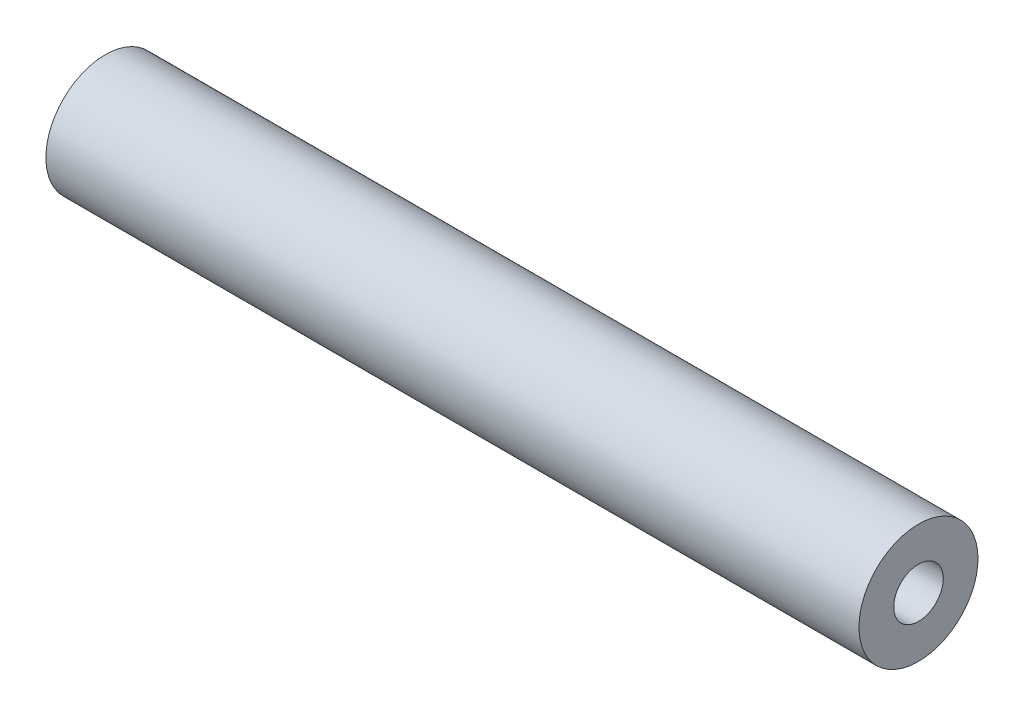
ISO-10303-21;
HEADER;
FILE_DESCRIPTION(('STEP AP214'),'2;1');
FILE_NAME('part.step','',(''),(''),'','','');
FILE_SCHEMA(('AUTOMOTIVE_DESIGN { 1 0 10303 214 1 1 1 1 }'));
ENDSEC;
DATA;
#1=APPLICATION_CONTEXT('core data for automotive mechanical design processes');
#2=APPLICATION_PROTOCOL_DEFINITION('international standard','automotive_design',2000,#1);
#3=PRODUCT_CONTEXT('',#1,'mechanical');
#4=PRODUCT('Part','Part','',(#3));
#5=PRODUCT_RELATED_PRODUCT_CATEGORY('part','',(#4));
#6=PRODUCT_DEFINITION_FORMATION('','',#4);
#7=PRODUCT_DEFINITION_CONTEXT('part definition',#1,'design');
#8=PRODUCT_DEFINITION('design','',#6,#7);
#9=PRODUCT_DEFINITION_SHAPE('','',#8);
#10=(LENGTH_UNIT() NAMED_UNIT(*) SI_UNIT(.MILLI.,.METRE.));
#11=(NAMED_UNIT(*) PLANE_ANGLE_UNIT() SI_UNIT($,.RADIAN.));
#12=(NAMED_UNIT(*) SI_UNIT($,.STERADIAN.) SOLID_ANGLE_UNIT());
#13=UNCERTAINTY_MEASURE_WITH_UNIT(LENGTH_MEASURE(1.E-05),#10,'distance_accuracy_value','');
#14=(GEOMETRIC_REPRESENTATION_CONTEXT(3) GLOBAL_UNCERTAINTY_ASSIGNED_CONTEXT((#13)) GLOBAL_UNIT_ASSIGNED_CONTEXT((#10,
#11,#12)) REPRESENTATION_CONTEXT('',''));
#15=CARTESIAN_POINT('',(0.,0.,0.));
#16=DIRECTION('',(0.,0.,1.));
#17=DIRECTION('',(1.,0.,0.));
#18=AXIS2_PLACEMENT_3D('',#15,#16,#17);
#19=CARTESIAN_POINT('',(0.,0.,0.));
#20=DIRECTION('',(-1.,0.,0.));
#21=DIRECTION('',(0.,0.,1.));
#22=AXIS2_PLACEMENT_3D('',#19,#20,#21);
#23=PLANE('',#22);
#24=CARTESIAN_POINT('',(0.,0.,0.));
#25=DIRECTION('',(1.,0.,0.));
#26=DIRECTION('',(0.,0.,-1.));
#27=AXIS2_PLACEMENT_3D('',#24,#25,#26);
#28=CIRCLE('',#27,3.);
#29=CARTESIAN_POINT('',(0.,0.,-3.));
#30=VERTEX_POINT('',#29);
#31=EDGE_CURVE('E10',#30,#30,#28,.T.);
#32=ORIENTED_EDGE('',*,*,#31,.F.);
#33=EDGE_LOOP('',(#32));
#34=FACE_BOUND('',#33,.T.);
#35=ADVANCED_FACE('F33',(#34),#23,.T.);
#36=CARTESIAN_POINT('',(0.,0.,0.));
#37=DIRECTION('',(1.,0.,0.));
#38=DIRECTION('',(0.,0.,-1.));
#39=AXIS2_PLACEMENT_3D('',#36,#37,#38);
#40=CYLINDRICAL_SURFACE('',#39,3.);
#41=ORIENTED_EDGE('',*,*,#31,.T.);
#42=EDGE_LOOP('',(#41));
#43=FACE_BOUND('',#42,.T.);
#44=CARTESIAN_POINT('',(41.,0.,0.));
#45=DIRECTION('',(1.,0.,0.));
#46=DIRECTION('',(0.,0.,-1.));
#47=AXIS2_PLACEMENT_3D('',#44,#45,#46);
#48=CIRCLE('',#47,3.);
#49=CARTESIAN_POINT('',(41.,0.,-3.));
#50=VERTEX_POINT('',#49);
#51=EDGE_CURVE('E39',#50,#50,#48,.T.);
#52=ORIENTED_EDGE('',*,*,#51,.F.);
#53=EDGE_LOOP('',(#52));
#54=FACE_BOUND('',#53,.T.);
#55=ADVANCED_FACE('F57',(#43,#54),#40,.T.);
#56=CARTESIAN_POINT('',(41.,0.,0.));
#57=DIRECTION('',(1.,0.,0.));
#58=DIRECTION('',(0.,0.,-1.));
#59=AXIS2_PLACEMENT_3D('',#56,#57,#58);
#60=PLANE('',#59);
#61=CARTESIAN_POINT('',(41.,0.,0.));
#62=DIRECTION('',(1.,0.,0.));
#63=DIRECTION('',(0.,0.,-1.));
#64=AXIS2_PLACEMENT_3D('',#61,#62,#63);
#65=CIRCLE('',#64,1.25);
#66=CARTESIAN_POINT('',(41.,0.,-1.25));
#67=VERTEX_POINT('',#66);
#68=EDGE_CURVE('E47',#67,#67,#65,.T.);
#69=ORIENTED_EDGE('',*,*,#68,.F.);
#70=EDGE_LOOP('',(#69));
#71=FACE_BOUND('',#70,.T.);
#72=ORIENTED_EDGE('',*,*,#51,.T.);
#73=EDGE_LOOP('',(#72));
#74=FACE_BOUND('',#73,.T.);
#75=ADVANCED_FACE('F55',(#71,#74),#60,.T.);
#76=CARTESIAN_POINT('',(31.,0.,0.));
#77=DIRECTION('',(1.,0.,0.));
#78=DIRECTION('',(0.,0.,-1.));
#79=AXIS2_PLACEMENT_3D('',#76,#77,#78);
#80=CYLINDRICAL_SURFACE('',#79,1.25);
#81=CARTESIAN_POINT('',(31.,0.,0.));
#82=DIRECTION('',(1.,0.,0.));
#83=DIRECTION('',(0.,0.,-1.));
#84=AXIS2_PLACEMENT_3D('',#81,#82,#83);
#85=CIRCLE('',#84,1.25);
#86=CARTESIAN_POINT('',(31.,0.,-1.25));
#87=VERTEX_POINT('',#86);
#88=EDGE_CURVE('E43',#87,#87,#85,.T.);
#89=ORIENTED_EDGE('',*,*,#88,.F.);
#90=EDGE_LOOP('',(#89));
#91=FACE_BOUND('',#90,.T.);
#92=ORIENTED_EDGE('',*,*,#68,.T.);
#93=EDGE_LOOP('',(#92));
#94=FACE_BOUND('',#93,.T.);
#95=ADVANCED_FACE('F53',(#91,#94),#80,.F.);
#96=CARTESIAN_POINT('',(31.,0.,0.));
#97=DIRECTION('',(1.,0.,0.));
#98=DIRECTION('',(0.,0.,-1.));
#99=AXIS2_PLACEMENT_3D('',#96,#97,#98);
#100=PLANE('',#99);
#101=ORIENTED_EDGE('',*,*,#88,.T.);
#102=EDGE_LOOP('',(#101));
#103=FACE_BOUND('',#102,.T.);
#104=ADVANCED_FACE('F63',(#103),#100,.T.);
#105=CLOSED_SHELL('',(#35,#55,#75,#95,#104));
#106=MANIFOLD_SOLID_BREP('B2',#105);
#107=ADVANCED_BREP_SHAPE_REPRESENTATION('',(#18,#106),#14);
#108=SHAPE_DEFINITION_REPRESENTATION(#9,#107);
ENDSEC;
END-ISO-10303-21;
